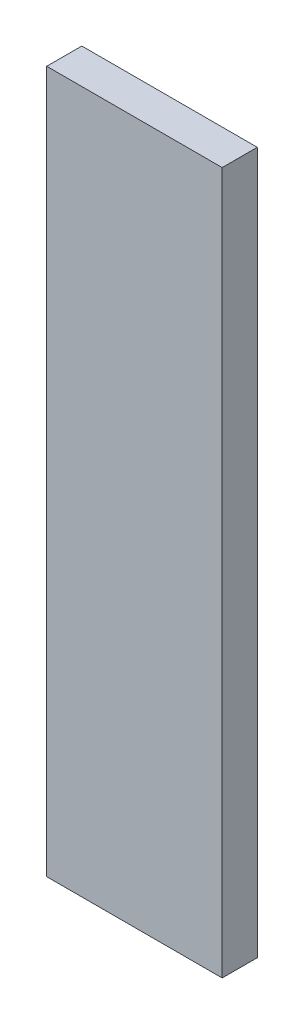
ISO-10303-21;
HEADER;
FILE_DESCRIPTION(('STEP AP214'),'2;1');
FILE_NAME('part.step','',(''),(''),'','','');
FILE_SCHEMA(('AUTOMOTIVE_DESIGN { 1 0 10303 214 1 1 1 1 }'));
ENDSEC;
DATA;
#1=APPLICATION_CONTEXT('core data for automotive mechanical design processes');
#2=APPLICATION_PROTOCOL_DEFINITION('international standard','automotive_design',2000,#1);
#3=PRODUCT_CONTEXT('',#1,'mechanical');
#4=PRODUCT('Part','Part','',(#3));
#5=PRODUCT_RELATED_PRODUCT_CATEGORY('part','',(#4));
#6=PRODUCT_DEFINITION_FORMATION('','',#4);
#7=PRODUCT_DEFINITION_CONTEXT('part definition',#1,'design');
#8=PRODUCT_DEFINITION('design','',#6,#7);
#9=PRODUCT_DEFINITION_SHAPE('','',#8);
#10=(LENGTH_UNIT() NAMED_UNIT(*) SI_UNIT(.MILLI.,.METRE.));
#11=(NAMED_UNIT(*) PLANE_ANGLE_UNIT() SI_UNIT($,.RADIAN.));
#12=(NAMED_UNIT(*) SI_UNIT($,.STERADIAN.) SOLID_ANGLE_UNIT());
#13=UNCERTAINTY_MEASURE_WITH_UNIT(LENGTH_MEASURE(1.E-05),#10,'distance_accuracy_value','');
#14=(GEOMETRIC_REPRESENTATION_CONTEXT(3) GLOBAL_UNCERTAINTY_ASSIGNED_CONTEXT((#13)) GLOBAL_UNIT_ASSIGNED_CONTEXT((#10,
#11,#12)) REPRESENTATION_CONTEXT('',''));
#15=CARTESIAN_POINT('',(0.,0.,0.));
#16=DIRECTION('',(0.,0.,1.));
#17=DIRECTION('',(1.,0.,0.));
#18=AXIS2_PLACEMENT_3D('',#15,#16,#17);
#19=CARTESIAN_POINT('',(14.9999999999977,60.0000000000023,6.));
#20=DIRECTION('',(-1.,0.,0.));
#21=DIRECTION('',(0.,-1.,0.));
#22=AXIS2_PLACEMENT_3D('',#19,#20,#21);
#23=PLANE('',#22);
#24=DIRECTION('',(0.,1.,0.));
#25=VECTOR('',#24,1.);
#26=CARTESIAN_POINT('',(14.9999999999977,60.0000000000023,0.));
#27=LINE('',#26,#25);
#28=CARTESIAN_POINT('',(14.9999999999977,-60.0000000000023,0.));
#29=VERTEX_POINT('',#28);
#30=CARTESIAN_POINT('',(14.9999999999977,60.0000000000023,0.));
#31=VERTEX_POINT('',#30);
#32=EDGE_CURVE('E98',#29,#31,#27,.T.);
#33=ORIENTED_EDGE('',*,*,#32,.T.);
#34=DIRECTION('',(0.,0.,-1.));
#35=VECTOR('',#34,1.);
#36=CARTESIAN_POINT('',(14.9999999999977,60.0000000000023,6.));
#37=LINE('',#36,#35);
#38=CARTESIAN_POINT('',(14.9999999999977,60.0000000000023,6.));
#39=VERTEX_POINT('',#38);
#40=EDGE_CURVE('E11',#39,#31,#37,.T.);
#41=ORIENTED_EDGE('',*,*,#40,.F.);
#42=DIRECTION('',(0.,1.,0.));
#43=VECTOR('',#42,1.);
#44=CARTESIAN_POINT('',(14.9999999999977,60.0000000000023,6.));
#45=LINE('',#44,#43);
#46=CARTESIAN_POINT('',(14.9999999999977,-60.0000000000023,6.));
#47=VERTEX_POINT('',#46);
#48=EDGE_CURVE('E86',#47,#39,#45,.T.);
#49=ORIENTED_EDGE('',*,*,#48,.F.);
#50=DIRECTION('',(0.,0.,-1.));
#51=VECTOR('',#50,1.);
#52=CARTESIAN_POINT('',(14.9999999999977,-60.0000000000023,6.));
#53=LINE('',#52,#51);
#54=EDGE_CURVE('E94',#47,#29,#53,.T.);
#55=ORIENTED_EDGE('',*,*,#54,.T.);
#56=EDGE_LOOP('',(#33,#41,#49,#55));
#57=FACE_BOUND('',#56,.T.);
#58=ADVANCED_FACE('F35',(#57),#23,.F.);
#59=CARTESIAN_POINT('',(-15.0000000000023,60.0000000000023,6.));
#60=DIRECTION('',(0.,-1.,0.));
#61=DIRECTION('',(0.,0.,-1.));
#62=AXIS2_PLACEMENT_3D('',#59,#60,#61);
#63=PLANE('',#62);
#64=DIRECTION('',(-1.,0.,0.));
#65=VECTOR('',#64,1.);
#66=CARTESIAN_POINT('',(-15.0000000000023,60.0000000000023,0.));
#67=LINE('',#66,#65);
#68=CARTESIAN_POINT('',(-15.0000000000023,60.0000000000023,0.));
#69=VERTEX_POINT('',#68);
#70=EDGE_CURVE('E90',#31,#69,#67,.T.);
#71=ORIENTED_EDGE('',*,*,#70,.T.);
#72=DIRECTION('',(0.,0.,-1.));
#73=VECTOR('',#72,1.);
#74=CARTESIAN_POINT('',(-15.0000000000023,60.0000000000023,6.));
#75=LINE('',#74,#73);
#76=CARTESIAN_POINT('',(-15.0000000000023,60.0000000000023,6.));
#77=VERTEX_POINT('',#76);
#78=EDGE_CURVE('E43',#77,#69,#75,.T.);
#79=ORIENTED_EDGE('',*,*,#78,.F.);
#80=DIRECTION('',(-1.,0.,0.));
#81=VECTOR('',#80,1.);
#82=CARTESIAN_POINT('',(-15.0000000000023,60.0000000000023,6.));
#83=LINE('',#82,#81);
#84=EDGE_CURVE('E81',#39,#77,#83,.T.);
#85=ORIENTED_EDGE('',*,*,#84,.F.);
#86=ORIENTED_EDGE('',*,*,#40,.T.);
#87=EDGE_LOOP('',(#71,#79,#85,#86));
#88=FACE_BOUND('',#87,.T.);
#89=ADVANCED_FACE('F89',(#88),#63,.F.);
#90=CARTESIAN_POINT('',(-15.0000000000023,60.0000000000023,6.));
#91=DIRECTION('',(1.,0.,0.));
#92=DIRECTION('',(0.,1.,0.));
#93=AXIS2_PLACEMENT_3D('',#90,#91,#92);
#94=PLANE('',#93);
#95=DIRECTION('',(0.,-1.,0.));
#96=VECTOR('',#95,1.);
#97=CARTESIAN_POINT('',(-15.0000000000023,60.0000000000023,0.));
#98=LINE('',#97,#96);
#99=CARTESIAN_POINT('',(-15.0000000000023,-60.0000000000023,0.));
#100=VERTEX_POINT('',#99);
#101=EDGE_CURVE('E68',#69,#100,#98,.T.);
#102=ORIENTED_EDGE('',*,*,#101,.T.);
#103=DIRECTION('',(0.,0.,-1.));
#104=VECTOR('',#103,1.);
#105=CARTESIAN_POINT('',(-15.0000000000023,-60.0000000000023,6.));
#106=LINE('',#105,#104);
#107=CARTESIAN_POINT('',(-15.0000000000023,-60.0000000000023,6.));
#108=VERTEX_POINT('',#107);
#109=EDGE_CURVE('E91',#108,#100,#106,.T.);
#110=ORIENTED_EDGE('',*,*,#109,.F.);
#111=DIRECTION('',(0.,-1.,0.));
#112=VECTOR('',#111,1.);
#113=CARTESIAN_POINT('',(-15.0000000000023,60.0000000000023,6.));
#114=LINE('',#113,#112);
#115=EDGE_CURVE('E84',#77,#108,#114,.T.);
#116=ORIENTED_EDGE('',*,*,#115,.F.);
#117=ORIENTED_EDGE('',*,*,#78,.T.);
#118=EDGE_LOOP('',(#102,#110,#116,#117));
#119=FACE_BOUND('',#118,.T.);
#120=ADVANCED_FACE('F92',(#119),#94,.F.);
#121=CARTESIAN_POINT('',(-15.0000000000023,-60.0000000000023,6.));
#122=DIRECTION('',(0.,1.,0.));
#123=DIRECTION('',(0.,0.,1.));
#124=AXIS2_PLACEMENT_3D('',#121,#122,#123);
#125=PLANE('',#124);
#126=DIRECTION('',(1.,0.,0.));
#127=VECTOR('',#126,1.);
#128=CARTESIAN_POINT('',(-15.0000000000023,-60.0000000000023,0.));
#129=LINE('',#128,#127);
#130=EDGE_CURVE('E74',#100,#29,#129,.T.);
#131=ORIENTED_EDGE('',*,*,#130,.T.);
#132=ORIENTED_EDGE('',*,*,#54,.F.);
#133=DIRECTION('',(1.,0.,0.));
#134=VECTOR('',#133,1.);
#135=CARTESIAN_POINT('',(-15.0000000000023,-60.0000000000023,6.));
#136=LINE('',#135,#134);
#137=EDGE_CURVE('E51',#108,#47,#136,.T.);
#138=ORIENTED_EDGE('',*,*,#137,.F.);
#139=ORIENTED_EDGE('',*,*,#109,.T.);
#140=EDGE_LOOP('',(#131,#132,#138,#139));
#141=FACE_BOUND('',#140,.T.);
#142=ADVANCED_FACE('F105',(#141),#125,.F.);
#143=CARTESIAN_POINT('',(0.,0.,6.));
#144=DIRECTION('',(0.,0.,1.));
#145=DIRECTION('',(1.,0.,0.));
#146=AXIS2_PLACEMENT_3D('',#143,#144,#145);
#147=PLANE('',#146);
#148=ORIENTED_EDGE('',*,*,#48,.T.);
#149=ORIENTED_EDGE('',*,*,#84,.T.);
#150=ORIENTED_EDGE('',*,*,#115,.T.);
#151=ORIENTED_EDGE('',*,*,#137,.T.);
#152=EDGE_LOOP('',(#148,#149,#150,#151));
#153=FACE_BOUND('',#152,.T.);
#154=ADVANCED_FACE('F82',(#153),#147,.T.);
#155=CARTESIAN_POINT('',(0.,0.,0.));
#156=DIRECTION('',(0.,0.,1.));
#157=DIRECTION('',(1.,0.,0.));
#158=AXIS2_PLACEMENT_3D('',#155,#156,#157);
#159=PLANE('',#158);
#160=ORIENTED_EDGE('',*,*,#32,.F.);
#161=ORIENTED_EDGE('',*,*,#130,.F.);
#162=ORIENTED_EDGE('',*,*,#101,.F.);
#163=ORIENTED_EDGE('',*,*,#70,.F.);
#164=EDGE_LOOP('',(#160,#161,#162,#163));
#165=FACE_BOUND('',#164,.T.);
#166=ADVANCED_FACE('F108',(#165),#159,.F.);
#167=CLOSED_SHELL('',(#58,#89,#120,#142,#154,#166));
#168=MANIFOLD_SOLID_BREP('B2',#167);
#169=ADVANCED_BREP_SHAPE_REPRESENTATION('',(#18,#168),#14);
#170=SHAPE_DEFINITION_REPRESENTATION(#9,#169);
ENDSEC;
END-ISO-10303-21;
